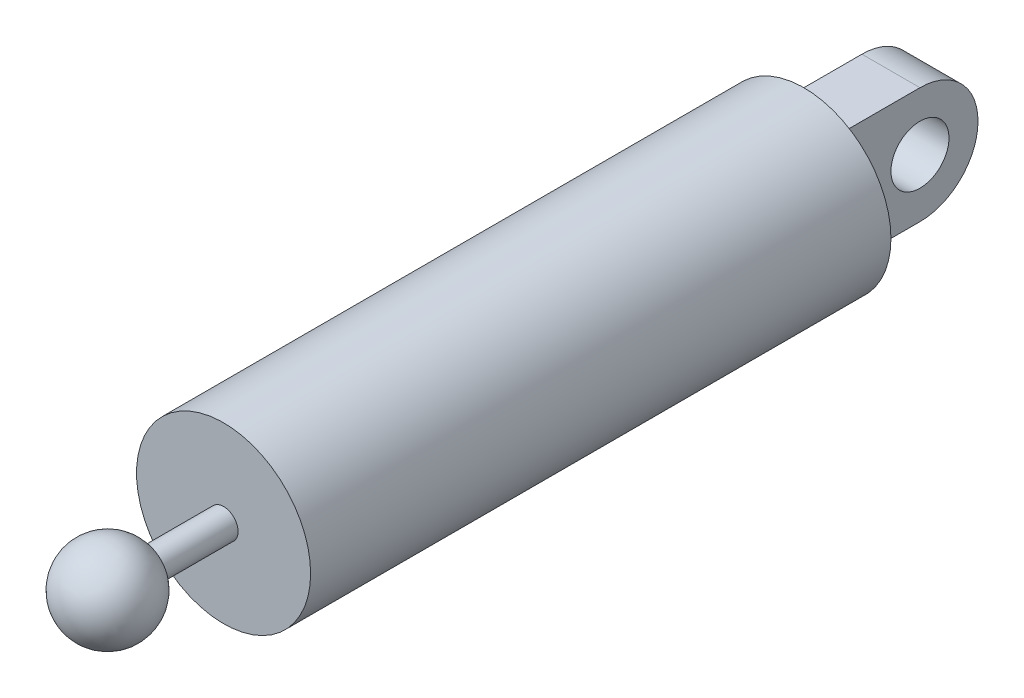
ISO-10303-21;
HEADER;
FILE_DESCRIPTION(('STEP AP214'),'2;1');
FILE_NAME('part.step','',(''),(''),'','','');
FILE_SCHEMA(('AUTOMOTIVE_DESIGN { 1 0 10303 214 1 1 1 1 }'));
ENDSEC;
DATA;
#1=APPLICATION_CONTEXT('core data for automotive mechanical design processes');
#2=APPLICATION_PROTOCOL_DEFINITION('international standard','automotive_design',2000,#1);
#3=PRODUCT_CONTEXT('',#1,'mechanical');
#4=PRODUCT('Part','Part','',(#3));
#5=PRODUCT_RELATED_PRODUCT_CATEGORY('part','',(#4));
#6=PRODUCT_DEFINITION_FORMATION('','',#4);
#7=PRODUCT_DEFINITION_CONTEXT('part definition',#1,'design');
#8=PRODUCT_DEFINITION('design','',#6,#7);
#9=PRODUCT_DEFINITION_SHAPE('','',#8);
#10=(LENGTH_UNIT() NAMED_UNIT(*) SI_UNIT(.MILLI.,.METRE.));
#11=(NAMED_UNIT(*) PLANE_ANGLE_UNIT() SI_UNIT($,.RADIAN.));
#12=(NAMED_UNIT(*) SI_UNIT($,.STERADIAN.) SOLID_ANGLE_UNIT());
#13=UNCERTAINTY_MEASURE_WITH_UNIT(LENGTH_MEASURE(1.E-05),#10,'distance_accuracy_value','');
#14=(GEOMETRIC_REPRESENTATION_CONTEXT(3) GLOBAL_UNCERTAINTY_ASSIGNED_CONTEXT((#13)) GLOBAL_UNIT_ASSIGNED_CONTEXT((#10,
#11,#12)) REPRESENTATION_CONTEXT('',''));
#15=CARTESIAN_POINT('',(0.,0.,0.));
#16=DIRECTION('',(0.,0.,1.));
#17=DIRECTION('',(1.,0.,0.));
#18=AXIS2_PLACEMENT_3D('',#15,#16,#17);
#19=CARTESIAN_POINT('',(0.,0.,60.));
#20=DIRECTION('',(0.,0.,-1.));
#21=DIRECTION('',(-1.,0.,0.));
#22=AXIS2_PLACEMENT_3D('',#19,#20,#21);
#23=CYLINDRICAL_SURFACE('',#22,1.25);
#24=CARTESIAN_POINT('',(0.,0.,50.));
#25=DIRECTION('',(0.,0.,1.));
#26=DIRECTION('',(1.,0.,0.));
#27=AXIS2_PLACEMENT_3D('',#24,#25,#26);
#28=CIRCLE('',#27,1.25);
#29=CARTESIAN_POINT('',(1.25,0.,50.));
#30=VERTEX_POINT('',#29);
#31=EDGE_CURVE('E136',#30,#30,#28,.T.);
#32=ORIENTED_EDGE('',*,*,#31,.T.);
#33=EDGE_LOOP('',(#32));
#34=FACE_BOUND('',#33,.T.);
#35=CARTESIAN_POINT('',(0.,0.,56.4644660940673));
#36=DIRECTION('',(0.,0.,1.));
#37=DIRECTION('',(1.,0.,0.));
#38=AXIS2_PLACEMENT_3D('',#35,#36,#37);
#39=CIRCLE('',#38,1.25);
#40=CARTESIAN_POINT('',(1.25,0.,56.4644660940673));
#41=VERTEX_POINT('',#40);
#42=EDGE_CURVE('E12',#41,#41,#39,.T.);
#43=ORIENTED_EDGE('',*,*,#42,.F.);
#44=EDGE_LOOP('',(#43));
#45=FACE_BOUND('',#44,.T.);
#46=ADVANCED_FACE('F75',(#34,#45),#23,.T.);
#47=CARTESIAN_POINT('',(2.5,5.,-12.5));
#48=DIRECTION('',(-1.,0.,0.));
#49=DIRECTION('',(0.,-1.,0.));
#50=AXIS2_PLACEMENT_3D('',#47,#48,#49);
#51=PLANE('',#50);
#52=CARTESIAN_POINT('',(2.5,0.,-7.5));
#53=DIRECTION('',(-1.,0.,0.));
#54=DIRECTION('',(0.,-1.,0.));
#55=AXIS2_PLACEMENT_3D('',#52,#53,#54);
#56=CIRCLE('',#55,2.5);
#57=CARTESIAN_POINT('',(2.5,-2.5,-7.5));
#58=VERTEX_POINT('',#57);
#59=EDGE_CURVE('E135',#58,#58,#56,.T.);
#60=ORIENTED_EDGE('',*,*,#59,.T.);
#61=EDGE_LOOP('',(#60));
#62=FACE_BOUND('',#61,.T.);
#63=CARTESIAN_POINT('',(2.5,0.,-7.5));
#64=DIRECTION('',(-1.,0.,0.));
#65=DIRECTION('',(0.,-1.,0.));
#66=AXIS2_PLACEMENT_3D('',#63,#64,#65);
#67=CIRCLE('',#66,5.);
#68=CARTESIAN_POINT('',(2.5,5.,-7.5));
#69=VERTEX_POINT('',#68);
#70=CARTESIAN_POINT('',(2.5,-5.,-7.5));
#71=VERTEX_POINT('',#70);
#72=EDGE_CURVE('E126',#69,#71,#67,.T.);
#73=ORIENTED_EDGE('',*,*,#72,.F.);
#74=DIRECTION('',(0.,0.,1.));
#75=VECTOR('',#74,1.);
#76=CARTESIAN_POINT('',(2.5,5.,-12.5));
#77=LINE('',#76,#75);
#78=CARTESIAN_POINT('',(2.5,5.,0.));
#79=VERTEX_POINT('',#78);
#80=EDGE_CURVE('E134',#69,#79,#77,.T.);
#81=ORIENTED_EDGE('',*,*,#80,.T.);
#82=DIRECTION('',(0.,-1.,0.));
#83=VECTOR('',#82,1.);
#84=CARTESIAN_POINT('',(2.5,5.,0.));
#85=LINE('',#84,#83);
#86=CARTESIAN_POINT('',(2.5,-5.,0.));
#87=VERTEX_POINT('',#86);
#88=EDGE_CURVE('E159',#79,#87,#85,.T.);
#89=ORIENTED_EDGE('',*,*,#88,.T.);
#90=DIRECTION('',(0.,0.,1.));
#91=VECTOR('',#90,1.);
#92=CARTESIAN_POINT('',(2.5,-5.,-12.5));
#93=LINE('',#92,#91);
#94=EDGE_CURVE('E90',#71,#87,#93,.T.);
#95=ORIENTED_EDGE('',*,*,#94,.F.);
#96=EDGE_LOOP('',(#73,#81,#89,#95));
#97=FACE_BOUND('',#96,.T.);
#98=ADVANCED_FACE('F187',(#62,#97),#51,.F.);
#99=CARTESIAN_POINT('',(-2.5,5.,-12.5));
#100=DIRECTION('',(1.,0.,0.));
#101=DIRECTION('',(0.,1.,0.));
#102=AXIS2_PLACEMENT_3D('',#99,#100,#101);
#103=PLANE('',#102);
#104=CARTESIAN_POINT('',(-2.5,0.,-7.5));
#105=DIRECTION('',(-1.,0.,0.));
#106=DIRECTION('',(0.,-1.,0.));
#107=AXIS2_PLACEMENT_3D('',#104,#105,#106);
#108=CIRCLE('',#107,2.5);
#109=CARTESIAN_POINT('',(-2.5,-2.5,-7.5));
#110=VERTEX_POINT('',#109);
#111=EDGE_CURVE('E127',#110,#110,#108,.T.);
#112=ORIENTED_EDGE('',*,*,#111,.F.);
#113=EDGE_LOOP('',(#112));
#114=FACE_BOUND('',#113,.T.);
#115=DIRECTION('',(0.,0.,1.));
#116=VECTOR('',#115,1.);
#117=CARTESIAN_POINT('',(-2.5,5.,-12.5));
#118=LINE('',#117,#116);
#119=CARTESIAN_POINT('',(-2.5,5.,-7.5));
#120=VERTEX_POINT('',#119);
#121=CARTESIAN_POINT('',(-2.5,5.,0.));
#122=VERTEX_POINT('',#121);
#123=EDGE_CURVE('E132',#120,#122,#118,.T.);
#124=ORIENTED_EDGE('',*,*,#123,.F.);
#125=CARTESIAN_POINT('',(-2.5,0.,-7.5));
#126=DIRECTION('',(-1.,0.,0.));
#127=DIRECTION('',(0.,-1.,0.));
#128=AXIS2_PLACEMENT_3D('',#125,#126,#127);
#129=CIRCLE('',#128,5.);
#130=CARTESIAN_POINT('',(-2.5,-5.,-7.5));
#131=VERTEX_POINT('',#130);
#132=EDGE_CURVE('E119',#120,#131,#129,.T.);
#133=ORIENTED_EDGE('',*,*,#132,.T.);
#134=DIRECTION('',(0.,0.,1.));
#135=VECTOR('',#134,1.);
#136=CARTESIAN_POINT('',(-2.5,-5.,-12.5));
#137=LINE('',#136,#135);
#138=CARTESIAN_POINT('',(-2.5,-5.,0.));
#139=VERTEX_POINT('',#138);
#140=EDGE_CURVE('E98',#131,#139,#137,.T.);
#141=ORIENTED_EDGE('',*,*,#140,.T.);
#142=DIRECTION('',(0.,1.,0.));
#143=VECTOR('',#142,1.);
#144=CARTESIAN_POINT('',(-2.5,5.,0.));
#145=LINE('',#144,#143);
#146=EDGE_CURVE('E139',#139,#122,#145,.T.);
#147=ORIENTED_EDGE('',*,*,#146,.T.);
#148=EDGE_LOOP('',(#124,#133,#141,#147));
#149=FACE_BOUND('',#148,.T.);
#150=ADVANCED_FACE('F138',(#114,#149),#103,.F.);
#151=CARTESIAN_POINT('',(-2.5,-5.,-12.5));
#152=DIRECTION('',(0.,1.,0.));
#153=DIRECTION('',(-1.,0.,0.));
#154=AXIS2_PLACEMENT_3D('',#151,#152,#153);
#155=PLANE('',#154);
#156=DIRECTION('',(-1.,0.,0.));
#157=VECTOR('',#156,1.);
#158=CARTESIAN_POINT('',(2.5,-5.,-7.5));
#159=LINE('',#158,#157);
#160=EDGE_CURVE('E124',#71,#131,#159,.T.);
#161=ORIENTED_EDGE('',*,*,#160,.F.);
#162=ORIENTED_EDGE('',*,*,#94,.T.);
#163=DIRECTION('',(-1.,0.,0.));
#164=VECTOR('',#163,1.);
#165=CARTESIAN_POINT('',(-2.5,-5.,0.));
#166=LINE('',#165,#164);
#167=EDGE_CURVE('E160',#87,#139,#166,.T.);
#168=ORIENTED_EDGE('',*,*,#167,.T.);
#169=ORIENTED_EDGE('',*,*,#140,.F.);
#170=EDGE_LOOP('',(#161,#162,#168,#169));
#171=FACE_BOUND('',#170,.T.);
#172=ADVANCED_FACE('F156',(#171),#155,.F.);
#173=CARTESIAN_POINT('',(0.,0.,0.));
#174=DIRECTION('',(0.,0.,1.));
#175=DIRECTION('',(1.,0.,0.));
#176=AXIS2_PLACEMENT_3D('',#173,#174,#175);
#177=PLANE('',#176);
#178=CARTESIAN_POINT('',(0.,0.,0.));
#179=DIRECTION('',(0.,0.,1.));
#180=DIRECTION('',(1.,0.,0.));
#181=AXIS2_PLACEMENT_3D('',#178,#179,#180);
#182=CIRCLE('',#181,7.5);
#183=CARTESIAN_POINT('',(7.5,0.,0.));
#184=VERTEX_POINT('',#183);
#185=EDGE_CURVE('E147',#184,#184,#182,.T.);
#186=ORIENTED_EDGE('',*,*,#185,.F.);
#187=EDGE_LOOP('',(#186));
#188=FACE_BOUND('',#187,.T.);
#189=ORIENTED_EDGE('',*,*,#88,.F.);
#190=DIRECTION('',(1.,0.,0.));
#191=VECTOR('',#190,1.);
#192=CARTESIAN_POINT('',(-2.5,5.,0.));
#193=LINE('',#192,#191);
#194=EDGE_CURVE('E142',#122,#79,#193,.T.);
#195=ORIENTED_EDGE('',*,*,#194,.F.);
#196=ORIENTED_EDGE('',*,*,#146,.F.);
#197=ORIENTED_EDGE('',*,*,#167,.F.);
#198=EDGE_LOOP('',(#189,#195,#196,#197));
#199=FACE_BOUND('',#198,.T.);
#200=ADVANCED_FACE('F153',(#188,#199),#177,.F.);
#201=CARTESIAN_POINT('',(0.,0.,50.));
#202=DIRECTION('',(0.,0.,-1.));
#203=DIRECTION('',(-1.,0.,0.));
#204=AXIS2_PLACEMENT_3D('',#201,#202,#203);
#205=CYLINDRICAL_SURFACE('',#204,7.5);
#206=CARTESIAN_POINT('',(0.,0.,50.));
#207=DIRECTION('',(0.,0.,1.));
#208=DIRECTION('',(1.,0.,0.));
#209=AXIS2_PLACEMENT_3D('',#206,#207,#208);
#210=CIRCLE('',#209,7.5);
#211=CARTESIAN_POINT('',(7.5,0.,50.));
#212=VERTEX_POINT('',#211);
#213=EDGE_CURVE('E83',#212,#212,#210,.T.);
#214=ORIENTED_EDGE('',*,*,#213,.F.);
#215=EDGE_LOOP('',(#214));
#216=FACE_BOUND('',#215,.T.);
#217=ORIENTED_EDGE('',*,*,#185,.T.);
#218=EDGE_LOOP('',(#217));
#219=FACE_BOUND('',#218,.T.);
#220=ADVANCED_FACE('F77',(#216,#219),#205,.T.);
#221=CARTESIAN_POINT('',(0.,0.,50.));
#222=DIRECTION('',(0.,0.,1.));
#223=DIRECTION('',(1.,0.,0.));
#224=AXIS2_PLACEMENT_3D('',#221,#222,#223);
#225=PLANE('',#224);
#226=ORIENTED_EDGE('',*,*,#31,.F.);
#227=EDGE_LOOP('',(#226));
#228=FACE_BOUND('',#227,.T.);
#229=ORIENTED_EDGE('',*,*,#213,.T.);
#230=EDGE_LOOP('',(#229));
#231=FACE_BOUND('',#230,.T.);
#232=ADVANCED_FACE('F177',(#228,#231),#225,.T.);
#233=CARTESIAN_POINT('',(-2.5,5.,-12.5));
#234=DIRECTION('',(0.,-1.,0.));
#235=DIRECTION('',(0.,0.,-1.));
#236=AXIS2_PLACEMENT_3D('',#233,#234,#235);
#237=PLANE('',#236);
#238=ORIENTED_EDGE('',*,*,#80,.F.);
#239=DIRECTION('',(-1.,0.,0.));
#240=VECTOR('',#239,1.);
#241=CARTESIAN_POINT('',(2.5,5.,-7.5));
#242=LINE('',#241,#240);
#243=EDGE_CURVE('E122',#69,#120,#242,.T.);
#244=ORIENTED_EDGE('',*,*,#243,.T.);
#245=ORIENTED_EDGE('',*,*,#123,.T.);
#246=ORIENTED_EDGE('',*,*,#194,.T.);
#247=EDGE_LOOP('',(#238,#244,#245,#246));
#248=FACE_BOUND('',#247,.T.);
#249=ADVANCED_FACE('F130',(#248),#237,.F.);
#250=CARTESIAN_POINT('',(2.5,0.,-7.5));
#251=DIRECTION('',(-1.,0.,0.));
#252=DIRECTION('',(0.,-1.,0.));
#253=AXIS2_PLACEMENT_3D('',#250,#251,#252);
#254=CYLINDRICAL_SURFACE('',#253,5.);
#255=ORIENTED_EDGE('',*,*,#132,.F.);
#256=ORIENTED_EDGE('',*,*,#243,.F.);
#257=ORIENTED_EDGE('',*,*,#72,.T.);
#258=ORIENTED_EDGE('',*,*,#160,.T.);
#259=EDGE_LOOP('',(#255,#256,#257,#258));
#260=FACE_BOUND('',#259,.T.);
#261=ADVANCED_FACE('F121',(#260),#254,.T.);
#262=CARTESIAN_POINT('',(2.5,0.,-7.5));
#263=DIRECTION('',(-1.,0.,0.));
#264=DIRECTION('',(0.,-1.,0.));
#265=AXIS2_PLACEMENT_3D('',#262,#263,#264);
#266=CYLINDRICAL_SURFACE('',#265,2.5);
#267=ORIENTED_EDGE('',*,*,#59,.F.);
#268=EDGE_LOOP('',(#267));
#269=FACE_BOUND('',#268,.T.);
#270=ORIENTED_EDGE('',*,*,#111,.T.);
#271=EDGE_LOOP('',(#270));
#272=FACE_BOUND('',#271,.T.);
#273=ADVANCED_FACE('F197',(#269,#272),#266,.F.);
#274=CARTESIAN_POINT('',(0.,0.,60.));
#275=DIRECTION('',(0.,1.,0.));
#276=DIRECTION('',(-1.,0.,0.));
#277=AXIS2_PLACEMENT_3D('',#274,#275,#276);
#278=SPHERICAL_SURFACE('',#277,3.75);
#279=CARTESIAN_POINT('',(0.,0.,60.));
#280=DIRECTION('',(0.,0.,1.));
#281=DIRECTION('',(1.,0.,0.));
#282=AXIS2_PLACEMENT_3D('',#279,#280,#281);
#283=SPHERICAL_SURFACE('',#282,3.75);
#284=ORIENTED_EDGE('',*,*,#42,.T.);
#285=EDGE_LOOP('',(#284));
#286=FACE_BOUND('',#285,.T.);
#287=ADVANCED_FACE('F196',(#286),#283,.T.);
#288=CLOSED_SHELL('',(#46,#98,#150,#172,#200,#220,#232,#249,#261,#273,#287));
#289=MANIFOLD_SOLID_BREP('B2',#288);
#290=ADVANCED_BREP_SHAPE_REPRESENTATION('',(#18,#289),#14);
#291=SHAPE_DEFINITION_REPRESENTATION(#9,#290);
ENDSEC;
END-ISO-10303-21;
